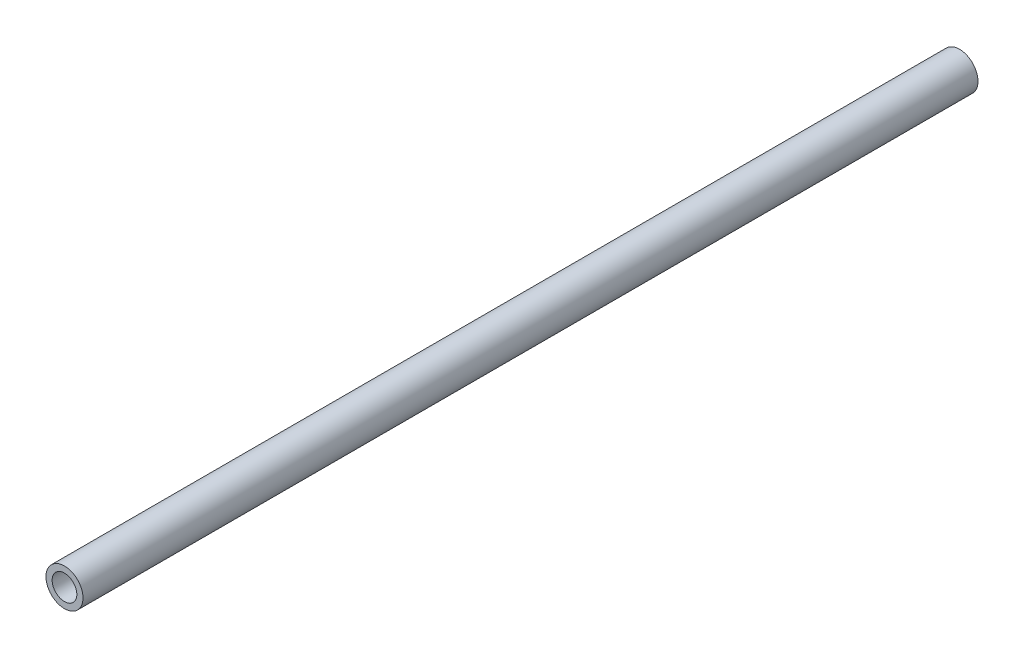
ISO-10303-21;
HEADER;
FILE_DESCRIPTION(('STEP AP214'),'2;1');
FILE_NAME('part.step','',(''),(''),'','','');
FILE_SCHEMA(('AUTOMOTIVE_DESIGN { 1 0 10303 214 1 1 1 1 }'));
ENDSEC;
DATA;
#1=APPLICATION_CONTEXT('core data for automotive mechanical design processes');
#2=APPLICATION_PROTOCOL_DEFINITION('international standard','automotive_design',2000,#1);
#3=PRODUCT_CONTEXT('',#1,'mechanical');
#4=PRODUCT('Part','Part','',(#3));
#5=PRODUCT_RELATED_PRODUCT_CATEGORY('part','',(#4));
#6=PRODUCT_DEFINITION_FORMATION('','',#4);
#7=PRODUCT_DEFINITION_CONTEXT('part definition',#1,'design');
#8=PRODUCT_DEFINITION('design','',#6,#7);
#9=PRODUCT_DEFINITION_SHAPE('','',#8);
#10=(LENGTH_UNIT() NAMED_UNIT(*) SI_UNIT(.MILLI.,.METRE.));
#11=(NAMED_UNIT(*) PLANE_ANGLE_UNIT() SI_UNIT($,.RADIAN.));
#12=(NAMED_UNIT(*) SI_UNIT($,.STERADIAN.) SOLID_ANGLE_UNIT());
#13=UNCERTAINTY_MEASURE_WITH_UNIT(LENGTH_MEASURE(1.E-05),#10,'distance_accuracy_value','');
#14=(GEOMETRIC_REPRESENTATION_CONTEXT(3) GLOBAL_UNCERTAINTY_ASSIGNED_CONTEXT((#13)) GLOBAL_UNIT_ASSIGNED_CONTEXT((#10,
#11,#12)) REPRESENTATION_CONTEXT('',''));
#15=CARTESIAN_POINT('',(0.,0.,0.));
#16=DIRECTION('',(0.,0.,1.));
#17=DIRECTION('',(1.,0.,0.));
#18=AXIS2_PLACEMENT_3D('',#15,#16,#17);
#19=CARTESIAN_POINT('',(0.,0.,145.));
#20=DIRECTION('',(0.,0.,1.));
#21=DIRECTION('',(1.,0.,0.));
#22=AXIS2_PLACEMENT_3D('',#19,#20,#21);
#23=PLANE('',#22);
#24=CARTESIAN_POINT('',(0.,0.,145.));
#25=DIRECTION('',(0.,0.,1.));
#26=DIRECTION('',(1.,0.,0.));
#27=AXIS2_PLACEMENT_3D('',#24,#25,#26);
#28=CIRCLE('',#27,3.);
#29=CARTESIAN_POINT('',(3.,0.,145.));
#30=VERTEX_POINT('',#29);
#31=EDGE_CURVE('E10',#30,#30,#28,.T.);
#32=ORIENTED_EDGE('',*,*,#31,.T.);
#33=EDGE_LOOP('',(#32));
#34=FACE_BOUND('',#33,.T.);
#35=CARTESIAN_POINT('',(0.,0.,145.));
#36=DIRECTION('',(0.,0.,1.));
#37=DIRECTION('',(1.,0.,0.));
#38=AXIS2_PLACEMENT_3D('',#35,#36,#37);
#39=CIRCLE('',#38,2.);
#40=CARTESIAN_POINT('',(2.,0.,145.));
#41=VERTEX_POINT('',#40);
#42=EDGE_CURVE('E54',#41,#41,#39,.T.);
#43=ORIENTED_EDGE('',*,*,#42,.F.);
#44=EDGE_LOOP('',(#43));
#45=FACE_BOUND('',#44,.T.);
#46=ADVANCED_FACE('F41',(#34,#45),#23,.T.);
#47=CARTESIAN_POINT('',(0.,0.,0.));
#48=DIRECTION('',(0.,0.,1.));
#49=DIRECTION('',(1.,0.,0.));
#50=AXIS2_PLACEMENT_3D('',#47,#48,#49);
#51=PLANE('',#50);
#52=CARTESIAN_POINT('',(0.,0.,0.));
#53=DIRECTION('',(0.,0.,1.));
#54=DIRECTION('',(1.,0.,0.));
#55=AXIS2_PLACEMENT_3D('',#52,#53,#54);
#56=CIRCLE('',#55,3.);
#57=CARTESIAN_POINT('',(3.,0.,0.));
#58=VERTEX_POINT('',#57);
#59=EDGE_CURVE('E45',#58,#58,#56,.T.);
#60=ORIENTED_EDGE('',*,*,#59,.F.);
#61=EDGE_LOOP('',(#60));
#62=FACE_BOUND('',#61,.T.);
#63=CARTESIAN_POINT('',(0.,0.,0.));
#64=DIRECTION('',(0.,0.,1.));
#65=DIRECTION('',(1.,0.,0.));
#66=AXIS2_PLACEMENT_3D('',#63,#64,#65);
#67=CIRCLE('',#66,2.);
#68=CARTESIAN_POINT('',(2.,0.,0.));
#69=VERTEX_POINT('',#68);
#70=EDGE_CURVE('E56',#69,#69,#67,.T.);
#71=ORIENTED_EDGE('',*,*,#70,.T.);
#72=EDGE_LOOP('',(#71));
#73=FACE_BOUND('',#72,.T.);
#74=ADVANCED_FACE('F68',(#62,#73),#51,.F.);
#75=CARTESIAN_POINT('',(0.,0.,145.));
#76=DIRECTION('',(0.,0.,-1.));
#77=DIRECTION('',(-1.,0.,0.));
#78=AXIS2_PLACEMENT_3D('',#75,#76,#77);
#79=CYLINDRICAL_SURFACE('',#78,3.);
#80=ORIENTED_EDGE('',*,*,#31,.F.);
#81=EDGE_LOOP('',(#80));
#82=FACE_BOUND('',#81,.T.);
#83=ORIENTED_EDGE('',*,*,#59,.T.);
#84=EDGE_LOOP('',(#83));
#85=FACE_BOUND('',#84,.T.);
#86=ADVANCED_FACE('F43',(#82,#85),#79,.T.);
#87=CARTESIAN_POINT('',(0.,0.,145.));
#88=DIRECTION('',(0.,0.,-1.));
#89=DIRECTION('',(-1.,0.,0.));
#90=AXIS2_PLACEMENT_3D('',#87,#88,#89);
#91=CYLINDRICAL_SURFACE('',#90,2.);
#92=ORIENTED_EDGE('',*,*,#42,.T.);
#93=EDGE_LOOP('',(#92));
#94=FACE_BOUND('',#93,.T.);
#95=ORIENTED_EDGE('',*,*,#70,.F.);
#96=EDGE_LOOP('',(#95));
#97=FACE_BOUND('',#96,.T.);
#98=ADVANCED_FACE('F64',(#94,#97),#91,.F.);
#99=CLOSED_SHELL('',(#46,#74,#86,#98));
#100=MANIFOLD_SOLID_BREP('B2',#99);
#101=ADVANCED_BREP_SHAPE_REPRESENTATION('',(#18,#100),#14);
#102=SHAPE_DEFINITION_REPRESENTATION(#9,#101);
ENDSEC;
END-ISO-10303-21;
